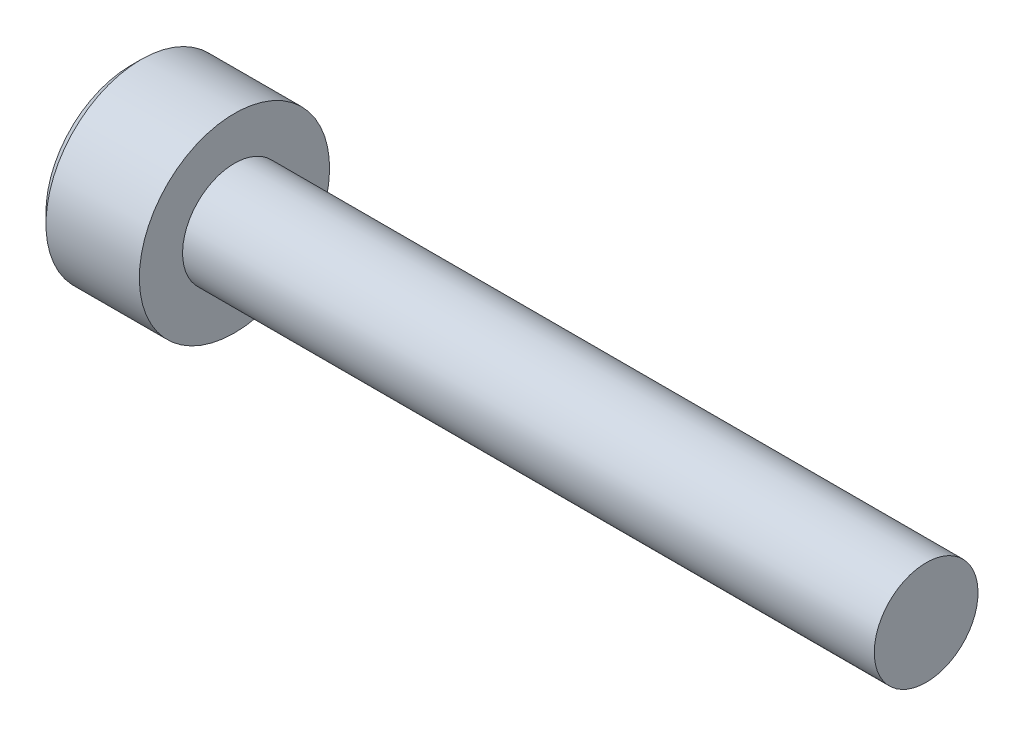
ISO-10303-21;
HEADER;
FILE_DESCRIPTION(('STEP AP214'),'2;1');
FILE_NAME('part.step','',(''),(''),'','','');
FILE_SCHEMA(('AUTOMOTIVE_DESIGN { 1 0 10303 214 1 1 1 1 }'));
ENDSEC;
DATA;
#1=APPLICATION_CONTEXT('core data for automotive mechanical design processes');
#2=APPLICATION_PROTOCOL_DEFINITION('international standard','automotive_design',2000,#1);
#3=PRODUCT_CONTEXT('',#1,'mechanical');
#4=PRODUCT('Part','Part','',(#3));
#5=PRODUCT_RELATED_PRODUCT_CATEGORY('part','',(#4));
#6=PRODUCT_DEFINITION_FORMATION('','',#4);
#7=PRODUCT_DEFINITION_CONTEXT('part definition',#1,'design');
#8=PRODUCT_DEFINITION('design','',#6,#7);
#9=PRODUCT_DEFINITION_SHAPE('','',#8);
#10=(LENGTH_UNIT() NAMED_UNIT(*) SI_UNIT(.MILLI.,.METRE.));
#11=(NAMED_UNIT(*) PLANE_ANGLE_UNIT() SI_UNIT($,.RADIAN.));
#12=(NAMED_UNIT(*) SI_UNIT($,.STERADIAN.) SOLID_ANGLE_UNIT());
#13=UNCERTAINTY_MEASURE_WITH_UNIT(LENGTH_MEASURE(1.E-05),#10,'distance_accuracy_value','');
#14=(GEOMETRIC_REPRESENTATION_CONTEXT(3) GLOBAL_UNCERTAINTY_ASSIGNED_CONTEXT((#13)) GLOBAL_UNIT_ASSIGNED_CONTEXT((#10,
#11,#12)) REPRESENTATION_CONTEXT('',''));
#15=CARTESIAN_POINT('',(0.,0.,0.));
#16=DIRECTION('',(0.,0.,1.));
#17=DIRECTION('',(1.,0.,0.));
#18=AXIS2_PLACEMENT_3D('',#15,#16,#17);
#19=CARTESIAN_POINT('',(-3.,0.,0.));
#20=DIRECTION('',(1.,0.,0.));
#21=DIRECTION('',(0.,1.,0.));
#22=AXIS2_PLACEMENT_3D('',#19,#20,#21);
#23=PLANE('',#22);
#24=CARTESIAN_POINT('',(-3.,0.,0.));
#25=DIRECTION('',(1.,0.,0.));
#26=DIRECTION('',(0.,1.,0.));
#27=AXIS2_PLACEMENT_3D('',#24,#25,#26);
#28=CIRCLE('',#27,2.45);
#29=CARTESIAN_POINT('',(-3.,2.45,0.));
#30=VERTEX_POINT('',#29);
#31=EDGE_CURVE('E45',#30,#30,#28,.F.);
#32=ORIENTED_EDGE('',*,*,#31,.T.);
#33=EDGE_LOOP('',(#32));
#34=FACE_BOUND('',#33,.T.);
#35=DIRECTION('',(0.,0.5,-0.866025403784439));
#36=VECTOR('',#35,1.);
#37=CARTESIAN_POINT('',(-3.,0.721687836487032,1.25));
#38=LINE('',#37,#36);
#39=CARTESIAN_POINT('',(-3.,0.721687836487031,1.25));
#40=VERTEX_POINT('',#39);
#41=CARTESIAN_POINT('',(-3.,1.44337567297406,0.));
#42=VERTEX_POINT('',#41);
#43=EDGE_CURVE('E150',#40,#42,#38,.T.);
#44=ORIENTED_EDGE('',*,*,#43,.F.);
#45=DIRECTION('',(0.,1.,0.));
#46=VECTOR('',#45,1.);
#47=CARTESIAN_POINT('',(-3.,-0.721687836487034,1.25));
#48=LINE('',#47,#46);
#49=CARTESIAN_POINT('',(-3.,-0.721687836487034,1.25));
#50=VERTEX_POINT('',#49);
#51=EDGE_CURVE('E123',#50,#40,#48,.T.);
#52=ORIENTED_EDGE('',*,*,#51,.F.);
#53=DIRECTION('',(0.,0.5,0.866025403784439));
#54=VECTOR('',#53,1.);
#55=CARTESIAN_POINT('',(-3.,-1.44337567297407,0.));
#56=LINE('',#55,#54);
#57=CARTESIAN_POINT('',(-3.,-1.44337567297407,0.));
#58=VERTEX_POINT('',#57);
#59=EDGE_CURVE('E119',#58,#50,#56,.T.);
#60=ORIENTED_EDGE('',*,*,#59,.F.);
#61=DIRECTION('',(0.,-0.5,0.866025403784439));
#62=VECTOR('',#61,1.);
#63=CARTESIAN_POINT('',(-3.,-0.721687836487033,-1.25));
#64=LINE('',#63,#62);
#65=CARTESIAN_POINT('',(-3.,-0.721687836487033,-1.25));
#66=VERTEX_POINT('',#65);
#67=EDGE_CURVE('E156',#66,#58,#64,.T.);
#68=ORIENTED_EDGE('',*,*,#67,.F.);
#69=DIRECTION('',(0.,-1.,0.));
#70=VECTOR('',#69,1.);
#71=CARTESIAN_POINT('',(-3.,0.721687836487032,-1.25));
#72=LINE('',#71,#70);
#73=CARTESIAN_POINT('',(-3.,0.721687836487032,-1.25));
#74=VERTEX_POINT('',#73);
#75=EDGE_CURVE('E154',#74,#66,#72,.T.);
#76=ORIENTED_EDGE('',*,*,#75,.F.);
#77=DIRECTION('',(0.,-0.5,-0.866025403784439));
#78=VECTOR('',#77,1.);
#79=CARTESIAN_POINT('',(-3.,1.44337567297406,0.));
#80=LINE('',#79,#78);
#81=EDGE_CURVE('E152',#42,#74,#80,.T.);
#82=ORIENTED_EDGE('',*,*,#81,.F.);
#83=EDGE_LOOP('',(#44,#52,#60,#68,#76,#82));
#84=FACE_BOUND('',#83,.T.);
#85=ADVANCED_FACE('F37',(#34,#84),#23,.F.);
#86=CARTESIAN_POINT('',(0.,1.5,0.));
#87=DIRECTION('',(-1.,0.,0.));
#88=DIRECTION('',(0.,-1.,0.));
#89=AXIS2_PLACEMENT_3D('',#86,#87,#88);
#90=PLANE('',#89);
#91=CARTESIAN_POINT('',(0.,0.,0.));
#92=DIRECTION('',(-1.,0.,0.));
#93=DIRECTION('',(0.,-1.,0.));
#94=AXIS2_PLACEMENT_3D('',#91,#92,#93);
#95=CIRCLE('',#94,2.75);
#96=CARTESIAN_POINT('',(0.,-2.75,0.));
#97=VERTEX_POINT('',#96);
#98=EDGE_CURVE('E182',#97,#97,#95,.T.);
#99=ORIENTED_EDGE('',*,*,#98,.F.);
#100=EDGE_LOOP('',(#99));
#101=FACE_BOUND('',#100,.T.);
#102=CARTESIAN_POINT('',(0.,0.,0.));
#103=DIRECTION('',(-1.,0.,0.));
#104=DIRECTION('',(0.,-1.,0.));
#105=AXIS2_PLACEMENT_3D('',#102,#103,#104);
#106=CIRCLE('',#105,1.5);
#107=CARTESIAN_POINT('',(0.,-1.5,0.));
#108=VERTEX_POINT('',#107);
#109=EDGE_CURVE('E176',#108,#108,#106,.T.);
#110=ORIENTED_EDGE('',*,*,#109,.T.);
#111=EDGE_LOOP('',(#110));
#112=FACE_BOUND('',#111,.T.);
#113=ADVANCED_FACE('F203',(#101,#112),#90,.F.);
#114=CARTESIAN_POINT('',(-3.,0.,0.));
#115=DIRECTION('',(-1.,0.,0.));
#116=DIRECTION('',(0.,-1.,0.));
#117=AXIS2_PLACEMENT_3D('',#114,#115,#116);
#118=CYLINDRICAL_SURFACE('',#117,2.75);
#119=CARTESIAN_POINT('',(-2.7,0.,0.));
#120=DIRECTION('',(1.,0.,0.));
#121=DIRECTION('',(0.,1.,0.));
#122=AXIS2_PLACEMENT_3D('',#119,#120,#121);
#123=CIRCLE('',#122,2.75);
#124=CARTESIAN_POINT('',(-2.7,2.75,0.));
#125=VERTEX_POINT('',#124);
#126=EDGE_CURVE('E11',#125,#125,#123,.T.);
#127=ORIENTED_EDGE('',*,*,#126,.T.);
#128=EDGE_LOOP('',(#127));
#129=FACE_BOUND('',#128,.T.);
#130=ORIENTED_EDGE('',*,*,#98,.T.);
#131=EDGE_LOOP('',(#130));
#132=FACE_BOUND('',#131,.T.);
#133=ADVANCED_FACE('F208',(#129,#132),#118,.T.);
#134=CARTESIAN_POINT('',(20.,1.5,0.));
#135=DIRECTION('',(-1.,0.,0.));
#136=DIRECTION('',(0.,-1.,0.));
#137=AXIS2_PLACEMENT_3D('',#134,#135,#136);
#138=PLANE('',#137);
#139=CARTESIAN_POINT('',(20.,0.,0.));
#140=DIRECTION('',(-1.,0.,0.));
#141=DIRECTION('',(0.,-1.,0.));
#142=AXIS2_PLACEMENT_3D('',#139,#140,#141);
#143=CIRCLE('',#142,1.5);
#144=CARTESIAN_POINT('',(20.,-1.5,0.));
#145=VERTEX_POINT('',#144);
#146=EDGE_CURVE('E179',#145,#145,#143,.T.);
#147=ORIENTED_EDGE('',*,*,#146,.F.);
#148=EDGE_LOOP('',(#147));
#149=FACE_BOUND('',#148,.T.);
#150=ADVANCED_FACE('F198',(#149),#138,.F.);
#151=CARTESIAN_POINT('',(-3.,0.,0.));
#152=DIRECTION('',(-1.,0.,0.));
#153=DIRECTION('',(0.,-1.,0.));
#154=AXIS2_PLACEMENT_3D('',#151,#152,#153);
#155=CYLINDRICAL_SURFACE('',#154,1.5);
#156=ORIENTED_EDGE('',*,*,#109,.F.);
#157=EDGE_LOOP('',(#156));
#158=FACE_BOUND('',#157,.T.);
#159=ORIENTED_EDGE('',*,*,#146,.T.);
#160=EDGE_LOOP('',(#159));
#161=FACE_BOUND('',#160,.T.);
#162=ADVANCED_FACE('F190',(#158,#161),#155,.T.);
#163=CARTESIAN_POINT('',(-3.,0.,0.));
#164=DIRECTION('',(1.,0.,0.));
#165=DIRECTION('',(0.,1.,0.));
#166=AXIS2_PLACEMENT_3D('',#163,#164,#165);
#167=CONICAL_SURFACE('',#166,2.45,0.785398163397444);
#168=ORIENTED_EDGE('',*,*,#126,.F.);
#169=EDGE_LOOP('',(#168));
#170=FACE_BOUND('',#169,.T.);
#171=ORIENTED_EDGE('',*,*,#31,.F.);
#172=EDGE_LOOP('',(#171));
#173=FACE_BOUND('',#172,.T.);
#174=ADVANCED_FACE('F39',(#170,#173),#167,.T.);
#175=CARTESIAN_POINT('',(-1.7,-0.721687836487034,1.25));
#176=DIRECTION('',(0.,0.,1.));
#177=DIRECTION('',(0.,-1.,0.));
#178=AXIS2_PLACEMENT_3D('',#175,#176,#177);
#179=PLANE('',#178);
#180=DIRECTION('',(0.,1.,0.));
#181=VECTOR('',#180,1.);
#182=CARTESIAN_POINT('',(-1.7,-0.721687836487034,1.25));
#183=LINE('',#182,#181);
#184=CARTESIAN_POINT('',(-1.7,-0.721687836487034,1.25));
#185=VERTEX_POINT('',#184);
#186=CARTESIAN_POINT('',(-1.7,0.,1.25));
#187=VERTEX_POINT('',#186);
#188=EDGE_CURVE('E60',#185,#187,#183,.T.);
#189=ORIENTED_EDGE('',*,*,#188,.F.);
#190=DIRECTION('',(-1.,0.,0.));
#191=VECTOR('',#190,1.);
#192=CARTESIAN_POINT('',(-1.7,-0.721687836487034,1.25));
#193=LINE('',#192,#191);
#194=EDGE_CURVE('E160',#185,#50,#193,.T.);
#195=ORIENTED_EDGE('',*,*,#194,.T.);
#196=ORIENTED_EDGE('',*,*,#51,.T.);
#197=DIRECTION('',(-1.,0.,0.));
#198=VECTOR('',#197,1.);
#199=CARTESIAN_POINT('',(-1.7,0.721687836487032,1.25));
#200=LINE('',#199,#198);
#201=CARTESIAN_POINT('',(-1.7,0.721687836487032,1.25));
#202=VERTEX_POINT('',#201);
#203=EDGE_CURVE('E52',#202,#40,#200,.T.);
#204=ORIENTED_EDGE('',*,*,#203,.F.);
#205=EDGE_CURVE('E112',#187,#202,#183,.T.);
#206=ORIENTED_EDGE('',*,*,#205,.F.);
#207=EDGE_LOOP('',(#189,#195,#196,#204,#206));
#208=FACE_BOUND('',#207,.T.);
#209=ADVANCED_FACE('F121',(#208),#179,.F.);
#210=CARTESIAN_POINT('',(-1.7,-1.44337567297407,0.));
#211=DIRECTION('',(0.,-0.866025403784439,0.5));
#212=DIRECTION('',(0.,-0.5,-0.866025403784439));
#213=AXIS2_PLACEMENT_3D('',#210,#211,#212);
#214=PLANE('',#213);
#215=DIRECTION('',(0.,0.5,0.866025403784439));
#216=VECTOR('',#215,1.);
#217=CARTESIAN_POINT('',(-1.7,-1.44337567297407,0.));
#218=LINE('',#217,#216);
#219=CARTESIAN_POINT('',(-1.7,-1.44337567297407,0.));
#220=VERTEX_POINT('',#219);
#221=CARTESIAN_POINT('',(-1.7,-1.08253175473055,0.625000000000001));
#222=VERTEX_POINT('',#221);
#223=EDGE_CURVE('E126',#220,#222,#218,.T.);
#224=ORIENTED_EDGE('',*,*,#223,.F.);
#225=DIRECTION('',(-1.,0.,0.));
#226=VECTOR('',#225,1.);
#227=CARTESIAN_POINT('',(-1.7,-1.44337567297407,0.));
#228=LINE('',#227,#226);
#229=EDGE_CURVE('E163',#220,#58,#228,.T.);
#230=ORIENTED_EDGE('',*,*,#229,.T.);
#231=ORIENTED_EDGE('',*,*,#59,.T.);
#232=ORIENTED_EDGE('',*,*,#194,.F.);
#233=EDGE_CURVE('E146',#222,#185,#218,.T.);
#234=ORIENTED_EDGE('',*,*,#233,.F.);
#235=EDGE_LOOP('',(#224,#230,#231,#232,#234));
#236=FACE_BOUND('',#235,.T.);
#237=ADVANCED_FACE('F196',(#236),#214,.F.);
#238=CARTESIAN_POINT('',(-1.7,-0.721687836487033,-1.25));
#239=DIRECTION('',(0.,-0.866025403784439,-0.5));
#240=DIRECTION('',(0.,0.5,-0.866025403784439));
#241=AXIS2_PLACEMENT_3D('',#238,#239,#240);
#242=PLANE('',#241);
#243=DIRECTION('',(0.,-0.5,0.866025403784439));
#244=VECTOR('',#243,1.);
#245=CARTESIAN_POINT('',(-1.7,-0.721687836487033,-1.25));
#246=LINE('',#245,#244);
#247=CARTESIAN_POINT('',(-1.7,-0.721687836487033,-1.25));
#248=VERTEX_POINT('',#247);
#249=CARTESIAN_POINT('',(-1.7,-1.08253175473055,-0.625));
#250=VERTEX_POINT('',#249);
#251=EDGE_CURVE('E143',#248,#250,#246,.T.);
#252=ORIENTED_EDGE('',*,*,#251,.F.);
#253=DIRECTION('',(-1.,0.,0.));
#254=VECTOR('',#253,1.);
#255=CARTESIAN_POINT('',(-1.7,-0.721687836487033,-1.25));
#256=LINE('',#255,#254);
#257=EDGE_CURVE('E166',#248,#66,#256,.T.);
#258=ORIENTED_EDGE('',*,*,#257,.T.);
#259=ORIENTED_EDGE('',*,*,#67,.T.);
#260=ORIENTED_EDGE('',*,*,#229,.F.);
#261=EDGE_CURVE('E142',#250,#220,#246,.T.);
#262=ORIENTED_EDGE('',*,*,#261,.F.);
#263=EDGE_LOOP('',(#252,#258,#259,#260,#262));
#264=FACE_BOUND('',#263,.T.);
#265=ADVANCED_FACE('F274',(#264),#242,.F.);
#266=CARTESIAN_POINT('',(-1.7,0.721687836487032,-1.25));
#267=DIRECTION('',(0.,0.,-1.));
#268=DIRECTION('',(-1.,0.,0.));
#269=AXIS2_PLACEMENT_3D('',#266,#267,#268);
#270=PLANE('',#269);
#271=DIRECTION('',(0.,-1.,0.));
#272=VECTOR('',#271,1.);
#273=CARTESIAN_POINT('',(-1.7,0.721687836487032,-1.25));
#274=LINE('',#273,#272);
#275=CARTESIAN_POINT('',(-1.7,0.721687836487032,-1.25));
#276=VERTEX_POINT('',#275);
#277=CARTESIAN_POINT('',(-1.7,0.,-1.25));
#278=VERTEX_POINT('',#277);
#279=EDGE_CURVE('E139',#276,#278,#274,.T.);
#280=ORIENTED_EDGE('',*,*,#279,.F.);
#281=DIRECTION('',(-1.,0.,0.));
#282=VECTOR('',#281,1.);
#283=CARTESIAN_POINT('',(-1.7,0.721687836487032,-1.25));
#284=LINE('',#283,#282);
#285=EDGE_CURVE('E169',#276,#74,#284,.T.);
#286=ORIENTED_EDGE('',*,*,#285,.T.);
#287=ORIENTED_EDGE('',*,*,#75,.T.);
#288=ORIENTED_EDGE('',*,*,#257,.F.);
#289=EDGE_CURVE('E138',#278,#248,#274,.T.);
#290=ORIENTED_EDGE('',*,*,#289,.F.);
#291=EDGE_LOOP('',(#280,#286,#287,#288,#290));
#292=FACE_BOUND('',#291,.T.);
#293=ADVANCED_FACE('F284',(#292),#270,.F.);
#294=CARTESIAN_POINT('',(-1.7,1.44337567297406,0.));
#295=DIRECTION('',(0.,0.866025403784439,-0.5));
#296=DIRECTION('',(0.,0.5,0.866025403784439));
#297=AXIS2_PLACEMENT_3D('',#294,#295,#296);
#298=PLANE('',#297);
#299=DIRECTION('',(0.,-0.5,-0.866025403784439));
#300=VECTOR('',#299,1.);
#301=CARTESIAN_POINT('',(-1.7,1.44337567297406,0.));
#302=LINE('',#301,#300);
#303=CARTESIAN_POINT('',(-1.7,1.44337567297406,0.));
#304=VERTEX_POINT('',#303);
#305=CARTESIAN_POINT('',(-1.7,1.08253175473055,-0.625));
#306=VERTEX_POINT('',#305);
#307=EDGE_CURVE('E134',#304,#306,#302,.T.);
#308=ORIENTED_EDGE('',*,*,#307,.F.);
#309=DIRECTION('',(-1.,0.,0.));
#310=VECTOR('',#309,1.);
#311=CARTESIAN_POINT('',(-1.7,1.44337567297406,0.));
#312=LINE('',#311,#310);
#313=EDGE_CURVE('E125',#304,#42,#312,.T.);
#314=ORIENTED_EDGE('',*,*,#313,.T.);
#315=ORIENTED_EDGE('',*,*,#81,.T.);
#316=ORIENTED_EDGE('',*,*,#285,.F.);
#317=EDGE_CURVE('E132',#306,#276,#302,.T.);
#318=ORIENTED_EDGE('',*,*,#317,.F.);
#319=EDGE_LOOP('',(#308,#314,#315,#316,#318));
#320=FACE_BOUND('',#319,.T.);
#321=ADVANCED_FACE('F294',(#320),#298,.F.);
#322=CARTESIAN_POINT('',(-1.7,0.721687836487032,1.25));
#323=DIRECTION('',(0.,0.866025403784439,0.5));
#324=DIRECTION('',(0.,-0.5,0.866025403784439));
#325=AXIS2_PLACEMENT_3D('',#322,#323,#324);
#326=PLANE('',#325);
#327=DIRECTION('',(0.,0.5,-0.866025403784439));
#328=VECTOR('',#327,1.);
#329=CARTESIAN_POINT('',(-1.7,0.721687836487032,1.25));
#330=LINE('',#329,#328);
#331=CARTESIAN_POINT('',(-1.7,1.08253175473055,0.625));
#332=VERTEX_POINT('',#331);
#333=EDGE_CURVE('E114',#202,#332,#330,.T.);
#334=ORIENTED_EDGE('',*,*,#333,.F.);
#335=ORIENTED_EDGE('',*,*,#203,.T.);
#336=ORIENTED_EDGE('',*,*,#43,.T.);
#337=ORIENTED_EDGE('',*,*,#313,.F.);
#338=EDGE_CURVE('E131',#332,#304,#330,.T.);
#339=ORIENTED_EDGE('',*,*,#338,.F.);
#340=EDGE_LOOP('',(#334,#335,#336,#337,#339));
#341=FACE_BOUND('',#340,.T.);
#342=ADVANCED_FACE('F129',(#341),#326,.F.);
#343=CARTESIAN_POINT('',(-1.7,0.,0.));
#344=DIRECTION('',(-1.,0.,0.));
#345=DIRECTION('',(0.,0.,1.));
#346=AXIS2_PLACEMENT_3D('',#343,#344,#345);
#347=PLANE('',#346);
#348=ORIENTED_EDGE('',*,*,#205,.T.);
#349=ORIENTED_EDGE('',*,*,#333,.T.);
#350=CARTESIAN_POINT('',(-1.7,0.,0.));
#351=DIRECTION('',(-1.,0.,0.));
#352=DIRECTION('',(0.,-1.,0.));
#353=AXIS2_PLACEMENT_3D('',#350,#351,#352);
#354=CIRCLE('',#353,1.25);
#355=EDGE_CURVE('E116',#187,#332,#354,.T.);
#356=ORIENTED_EDGE('',*,*,#355,.F.);
#357=EDGE_LOOP('',(#348,#349,#356));
#358=FACE_BOUND('',#357,.T.);
#359=ADVANCED_FACE('F113',(#358),#347,.T.);
#360=ORIENTED_EDGE('',*,*,#338,.T.);
#361=ORIENTED_EDGE('',*,*,#307,.T.);
#362=EDGE_CURVE('E394',#332,#306,#354,.T.);
#363=ORIENTED_EDGE('',*,*,#362,.F.);
#364=EDGE_LOOP('',(#360,#361,#363));
#365=FACE_BOUND('',#364,.T.);
#366=ADVANCED_FACE('F321',(#365),#347,.T.);
#367=ORIENTED_EDGE('',*,*,#317,.T.);
#368=ORIENTED_EDGE('',*,*,#279,.T.);
#369=EDGE_CURVE('E396',#306,#278,#354,.T.);
#370=ORIENTED_EDGE('',*,*,#369,.F.);
#371=EDGE_LOOP('',(#367,#368,#370));
#372=FACE_BOUND('',#371,.T.);
#373=ADVANCED_FACE('F331',(#372),#347,.T.);
#374=ORIENTED_EDGE('',*,*,#289,.T.);
#375=ORIENTED_EDGE('',*,*,#251,.T.);
#376=EDGE_CURVE('E397',#278,#250,#354,.T.);
#377=ORIENTED_EDGE('',*,*,#376,.F.);
#378=EDGE_LOOP('',(#374,#375,#377));
#379=FACE_BOUND('',#378,.T.);
#380=ADVANCED_FACE('F340',(#379),#347,.T.);
#381=ORIENTED_EDGE('',*,*,#261,.T.);
#382=ORIENTED_EDGE('',*,*,#223,.T.);
#383=EDGE_CURVE('E162',#250,#222,#354,.T.);
#384=ORIENTED_EDGE('',*,*,#383,.F.);
#385=EDGE_LOOP('',(#381,#382,#384));
#386=FACE_BOUND('',#385,.T.);
#387=ADVANCED_FACE('F349',(#386),#347,.T.);
#388=ORIENTED_EDGE('',*,*,#233,.T.);
#389=ORIENTED_EDGE('',*,*,#188,.T.);
#390=EDGE_CURVE('E174',#222,#187,#354,.T.);
#391=ORIENTED_EDGE('',*,*,#390,.F.);
#392=EDGE_LOOP('',(#388,#389,#391));
#393=FACE_BOUND('',#392,.T.);
#394=ADVANCED_FACE('F323',(#393),#347,.T.);
#395=CARTESIAN_POINT('',(-0.948924226215541,0.,0.));
#396=DIRECTION('',(-1.,0.,0.));
#397=DIRECTION('',(0.,-1.,0.));
#398=AXIS2_PLACEMENT_3D('',#395,#396,#397);
#399=CONICAL_SURFACE('',#398,0.,1.02974425867665);
#400=ORIENTED_EDGE('',*,*,#390,.T.);
#401=ORIENTED_EDGE('',*,*,#355,.T.);
#402=ORIENTED_EDGE('',*,*,#362,.T.);
#403=ORIENTED_EDGE('',*,*,#369,.T.);
#404=ORIENTED_EDGE('',*,*,#376,.T.);
#405=ORIENTED_EDGE('',*,*,#383,.T.);
#406=EDGE_LOOP('',(#400,#401,#402,#403,#404,#405));
#407=FACE_BOUND('',#406,.T.);
#408=CARTESIAN_POINT('',(-0.948924226215541,0.,0.));
#409=VERTEX_POINT('',#408);
#410=VERTEX_LOOP('',#409);
#411=FACE_BOUND('',#410,.T.);
#412=ADVANCED_FACE('F366',(#407,#411),#399,.F.);
#413=CLOSED_SHELL('',(#85,#113,#133,#150,#162,#174,#209,#237,#265,#293,#321,#342,#359,#366,#373,
#380,#387,#394,#412));
#414=MANIFOLD_SOLID_BREP('B2',#413);
#415=ADVANCED_BREP_SHAPE_REPRESENTATION('',(#18,#414),#14);
#416=SHAPE_DEFINITION_REPRESENTATION(#9,#415);
ENDSEC;
END-ISO-10303-21;
